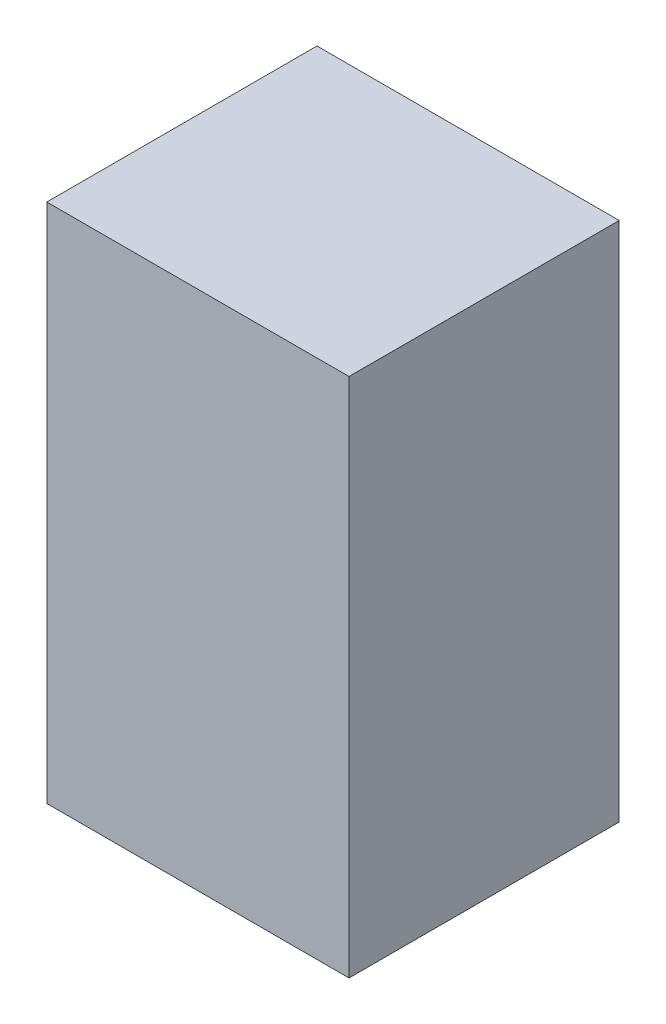
ISO-10303-21;
HEADER;
FILE_DESCRIPTION(('STEP AP214'),'2;1');
FILE_NAME('part.step','',(''),(''),'','','');
FILE_SCHEMA(('AUTOMOTIVE_DESIGN { 1 0 10303 214 1 1 1 1 }'));
ENDSEC;
DATA;
#1=APPLICATION_CONTEXT('core data for automotive mechanical design processes');
#2=APPLICATION_PROTOCOL_DEFINITION('international standard','automotive_design',2000,#1);
#3=PRODUCT_CONTEXT('',#1,'mechanical');
#4=PRODUCT('Part','Part','',(#3));
#5=PRODUCT_RELATED_PRODUCT_CATEGORY('part','',(#4));
#6=PRODUCT_DEFINITION_FORMATION('','',#4);
#7=PRODUCT_DEFINITION_CONTEXT('part definition',#1,'design');
#8=PRODUCT_DEFINITION('design','',#6,#7);
#9=PRODUCT_DEFINITION_SHAPE('','',#8);
#10=(LENGTH_UNIT() NAMED_UNIT(*) SI_UNIT(.MILLI.,.METRE.));
#11=(NAMED_UNIT(*) PLANE_ANGLE_UNIT() SI_UNIT($,.RADIAN.));
#12=(NAMED_UNIT(*) SI_UNIT($,.STERADIAN.) SOLID_ANGLE_UNIT());
#13=UNCERTAINTY_MEASURE_WITH_UNIT(LENGTH_MEASURE(1.E-05),#10,'distance_accuracy_value','');
#14=(GEOMETRIC_REPRESENTATION_CONTEXT(3) GLOBAL_UNCERTAINTY_ASSIGNED_CONTEXT((#13)) GLOBAL_UNIT_ASSIGNED_CONTEXT((#10,
#11,#12)) REPRESENTATION_CONTEXT('',''));
#15=CARTESIAN_POINT('',(0.,0.,0.));
#16=DIRECTION('',(0.,0.,1.));
#17=DIRECTION('',(1.,0.,0.));
#18=AXIS2_PLACEMENT_3D('',#15,#16,#17);
#19=CARTESIAN_POINT('',(19.0210778264979,4.28018817274697,1.7018));
#20=DIRECTION('',(-1.,0.,0.));
#21=DIRECTION('',(0.,0.,1.));
#22=AXIS2_PLACEMENT_3D('',#19,#20,#21);
#23=PLANE('',#22);
#24=DIRECTION('',(0.,1.,0.));
#25=VECTOR('',#24,1.);
#26=CARTESIAN_POINT('',(19.0210778264979,2.35219377142976,1.7018));
#27=LINE('',#26,#25);
#28=CARTESIAN_POINT('',(19.0210778264979,2.35219377142976,1.7018));
#29=VERTEX_POINT('',#28);
#30=CARTESIAN_POINT('',(19.0210778264979,4.28018817274697,1.7018));
#31=VERTEX_POINT('',#30);
#32=EDGE_CURVE('E72',#29,#31,#27,.T.);
#33=ORIENTED_EDGE('',*,*,#32,.F.);
#34=DIRECTION('',(0.,0.,1.));
#35=VECTOR('',#34,1.);
#36=CARTESIAN_POINT('',(19.0210778264979,2.35219377142976,1.7018));
#37=LINE('',#36,#35);
#38=CARTESIAN_POINT('',(19.0210778264979,2.35219377142976,2.7018));
#39=VERTEX_POINT('',#38);
#40=EDGE_CURVE('E67',#29,#39,#37,.T.);
#41=ORIENTED_EDGE('',*,*,#40,.T.);
#42=DIRECTION('',(0.,-1.,0.));
#43=VECTOR('',#42,1.);
#44=CARTESIAN_POINT('',(19.0210778264979,2.35219377142976,2.7018));
#45=LINE('',#44,#43);
#46=CARTESIAN_POINT('',(19.0210778264979,4.28018817274697,2.7018));
#47=VERTEX_POINT('',#46);
#48=EDGE_CURVE('E69',#47,#39,#45,.T.);
#49=ORIENTED_EDGE('',*,*,#48,.F.);
#50=DIRECTION('',(0.,0.,1.));
#51=VECTOR('',#50,1.);
#52=CARTESIAN_POINT('',(19.0210778264979,4.28018817274697,1.7018));
#53=LINE('',#52,#51);
#54=EDGE_CURVE('E11',#31,#47,#53,.T.);
#55=ORIENTED_EDGE('',*,*,#54,.F.);
#56=EDGE_LOOP('',(#33,#41,#49,#55));
#57=FACE_BOUND('',#56,.T.);
#58=ADVANCED_FACE('F16',(#57),#23,.T.);
#59=CARTESIAN_POINT('',(20.1395276173172,4.28018817274697,1.7018));
#60=DIRECTION('',(0.,1.,0.));
#61=DIRECTION('',(1.,0.,0.));
#62=AXIS2_PLACEMENT_3D('',#59,#60,#61);
#63=PLANE('',#62);
#64=DIRECTION('',(1.,0.,0.));
#65=VECTOR('',#64,1.);
#66=CARTESIAN_POINT('',(19.0210778264979,4.28018817274697,1.7018));
#67=LINE('',#66,#65);
#68=CARTESIAN_POINT('',(20.1395276173172,4.28018817274697,1.7018));
#69=VERTEX_POINT('',#68);
#70=EDGE_CURVE('E100',#31,#69,#67,.T.);
#71=ORIENTED_EDGE('',*,*,#70,.F.);
#72=ORIENTED_EDGE('',*,*,#54,.T.);
#73=DIRECTION('',(-1.,0.,0.));
#74=VECTOR('',#73,1.);
#75=CARTESIAN_POINT('',(19.0210778264979,4.28018817274697,2.7018));
#76=LINE('',#75,#74);
#77=CARTESIAN_POINT('',(20.1395276173172,4.28018817274697,2.7018));
#78=VERTEX_POINT('',#77);
#79=EDGE_CURVE('E85',#78,#47,#76,.T.);
#80=ORIENTED_EDGE('',*,*,#79,.F.);
#81=DIRECTION('',(0.,0.,1.));
#82=VECTOR('',#81,1.);
#83=CARTESIAN_POINT('',(20.1395276173172,4.28018817274697,1.7018));
#84=LINE('',#83,#82);
#85=EDGE_CURVE('E26',#69,#78,#84,.T.);
#86=ORIENTED_EDGE('',*,*,#85,.F.);
#87=EDGE_LOOP('',(#71,#72,#80,#86));
#88=FACE_BOUND('',#87,.T.);
#89=ADVANCED_FACE('F163',(#88),#63,.T.);
#90=CARTESIAN_POINT('',(20.1395276173172,2.35219377142976,1.7018));
#91=DIRECTION('',(1.,0.,0.));
#92=DIRECTION('',(0.,1.,0.));
#93=AXIS2_PLACEMENT_3D('',#90,#91,#92);
#94=PLANE('',#93);
#95=DIRECTION('',(0.,-1.,0.));
#96=VECTOR('',#95,1.);
#97=CARTESIAN_POINT('',(20.1395276173172,4.28018817274697,1.7018));
#98=LINE('',#97,#96);
#99=CARTESIAN_POINT('',(20.1395276173172,2.35219377142976,1.7018));
#100=VERTEX_POINT('',#99);
#101=EDGE_CURVE('E19',#69,#100,#98,.T.);
#102=ORIENTED_EDGE('',*,*,#101,.F.);
#103=ORIENTED_EDGE('',*,*,#85,.T.);
#104=DIRECTION('',(0.,1.,0.));
#105=VECTOR('',#104,1.);
#106=CARTESIAN_POINT('',(20.1395276173172,4.28018817274697,2.7018));
#107=LINE('',#106,#105);
#108=CARTESIAN_POINT('',(20.1395276173172,2.35219377142976,2.7018));
#109=VERTEX_POINT('',#108);
#110=EDGE_CURVE('E91',#109,#78,#107,.T.);
#111=ORIENTED_EDGE('',*,*,#110,.F.);
#112=DIRECTION('',(0.,0.,1.));
#113=VECTOR('',#112,1.);
#114=CARTESIAN_POINT('',(20.1395276173172,2.35219377142976,1.7018));
#115=LINE('',#114,#113);
#116=EDGE_CURVE('E78',#100,#109,#115,.T.);
#117=ORIENTED_EDGE('',*,*,#116,.F.);
#118=EDGE_LOOP('',(#102,#103,#111,#117));
#119=FACE_BOUND('',#118,.T.);
#120=ADVANCED_FACE('F168',(#119),#94,.T.);
#121=CARTESIAN_POINT('',(19.0210778264979,2.35219377142976,1.7018));
#122=DIRECTION('',(0.,-1.,0.));
#123=DIRECTION('',(0.,0.,-1.));
#124=AXIS2_PLACEMENT_3D('',#121,#122,#123);
#125=PLANE('',#124);
#126=DIRECTION('',(-1.,0.,0.));
#127=VECTOR('',#126,1.);
#128=CARTESIAN_POINT('',(20.1395276173172,2.35219377142976,1.7018));
#129=LINE('',#128,#127);
#130=EDGE_CURVE('E103',#100,#29,#129,.T.);
#131=ORIENTED_EDGE('',*,*,#130,.F.);
#132=ORIENTED_EDGE('',*,*,#116,.T.);
#133=DIRECTION('',(1.,0.,0.));
#134=VECTOR('',#133,1.);
#135=CARTESIAN_POINT('',(20.1395276173172,2.35219377142976,2.7018));
#136=LINE('',#135,#134);
#137=EDGE_CURVE('E84',#39,#109,#136,.T.);
#138=ORIENTED_EDGE('',*,*,#137,.F.);
#139=ORIENTED_EDGE('',*,*,#40,.F.);
#140=EDGE_LOOP('',(#131,#132,#138,#139));
#141=FACE_BOUND('',#140,.T.);
#142=ADVANCED_FACE('F88',(#141),#125,.T.);
#143=CARTESIAN_POINT('',(19.5803027219076,3.31619097208836,2.7018));
#144=DIRECTION('',(0.,0.,1.));
#145=DIRECTION('',(1.,0.,0.));
#146=AXIS2_PLACEMENT_3D('',#143,#144,#145);
#147=PLANE('',#146);
#148=ORIENTED_EDGE('',*,*,#137,.T.);
#149=ORIENTED_EDGE('',*,*,#110,.T.);
#150=ORIENTED_EDGE('',*,*,#79,.T.);
#151=ORIENTED_EDGE('',*,*,#48,.T.);
#152=EDGE_LOOP('',(#148,#149,#150,#151));
#153=FACE_BOUND('',#152,.T.);
#154=ADVANCED_FACE('F82',(#153),#147,.T.);
#155=CARTESIAN_POINT('',(19.5803027219076,3.31619097208836,1.7018));
#156=DIRECTION('',(0.,0.,1.));
#157=DIRECTION('',(1.,0.,0.));
#158=AXIS2_PLACEMENT_3D('',#155,#156,#157);
#159=PLANE('',#158);
#160=ORIENTED_EDGE('',*,*,#130,.T.);
#161=ORIENTED_EDGE('',*,*,#32,.T.);
#162=ORIENTED_EDGE('',*,*,#70,.T.);
#163=ORIENTED_EDGE('',*,*,#101,.T.);
#164=EDGE_LOOP('',(#160,#161,#162,#163));
#165=FACE_BOUND('',#164,.T.);
#166=ADVANCED_FACE('F180',(#165),#159,.F.);
#167=CLOSED_SHELL('',(#58,#89,#120,#142,#154,#166));
#168=MANIFOLD_SOLID_BREP('B1',#167);
#169=ADVANCED_BREP_SHAPE_REPRESENTATION('',(#18,#168),#14);
#170=SHAPE_DEFINITION_REPRESENTATION(#9,#169);
ENDSEC;
END-ISO-10303-21;
